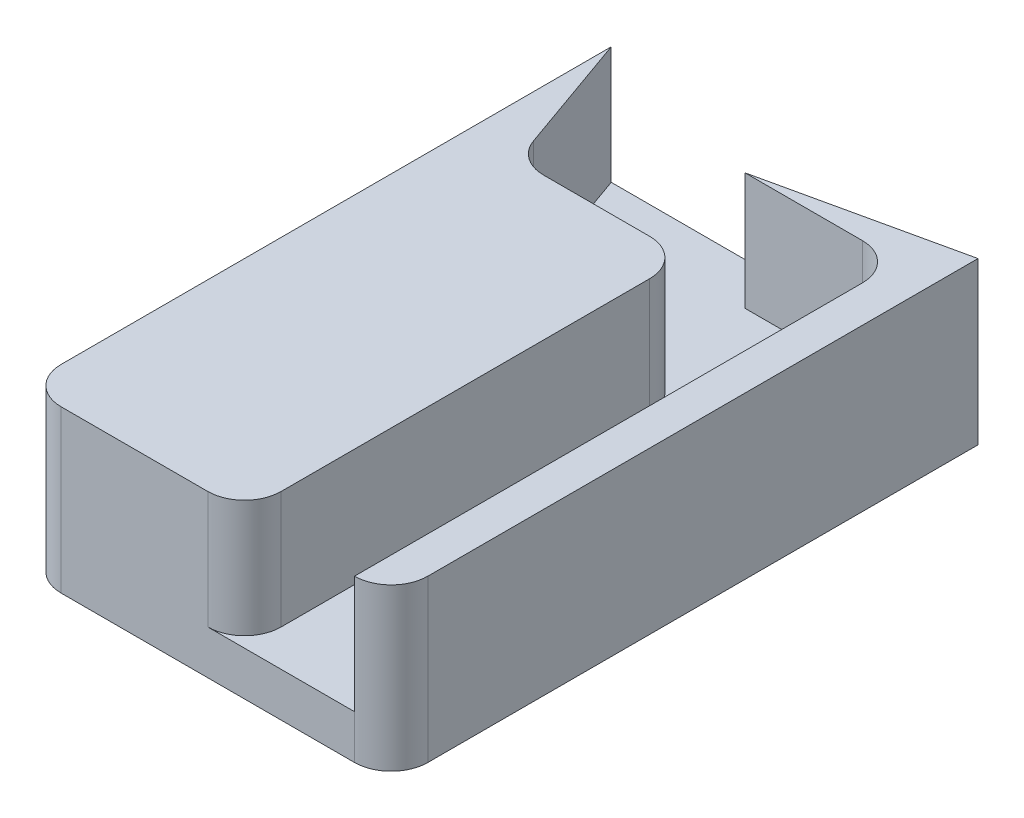
ISO-10303-21;
HEADER;
FILE_DESCRIPTION(('STEP AP214'),'2;1');
FILE_NAME('part.step','',(''),(''),'','','');
FILE_SCHEMA(('AUTOMOTIVE_DESIGN { 1 0 10303 214 1 1 1 1 }'));
ENDSEC;
DATA;
#1=APPLICATION_CONTEXT('core data for automotive mechanical design processes');
#2=APPLICATION_PROTOCOL_DEFINITION('international standard','automotive_design',2000,#1);
#3=PRODUCT_CONTEXT('',#1,'mechanical');
#4=PRODUCT('Part','Part','',(#3));
#5=PRODUCT_RELATED_PRODUCT_CATEGORY('part','',(#4));
#6=PRODUCT_DEFINITION_FORMATION('','',#4);
#7=PRODUCT_DEFINITION_CONTEXT('part definition',#1,'design');
#8=PRODUCT_DEFINITION('design','',#6,#7);
#9=PRODUCT_DEFINITION_SHAPE('','',#8);
#10=(LENGTH_UNIT() NAMED_UNIT(*) SI_UNIT(.MILLI.,.METRE.));
#11=(NAMED_UNIT(*) PLANE_ANGLE_UNIT() SI_UNIT($,.RADIAN.));
#12=(NAMED_UNIT(*) SI_UNIT($,.STERADIAN.) SOLID_ANGLE_UNIT());
#13=UNCERTAINTY_MEASURE_WITH_UNIT(LENGTH_MEASURE(1.E-05),#10,'distance_accuracy_value','');
#14=(GEOMETRIC_REPRESENTATION_CONTEXT(3) GLOBAL_UNCERTAINTY_ASSIGNED_CONTEXT((#13)) GLOBAL_UNIT_ASSIGNED_CONTEXT((#10,
#11,#12)) REPRESENTATION_CONTEXT('',''));
#15=CARTESIAN_POINT('',(0.,0.,0.));
#16=DIRECTION('',(0.,0.,1.));
#17=DIRECTION('',(1.,0.,0.));
#18=AXIS2_PLACEMENT_3D('',#15,#16,#17);
#19=CARTESIAN_POINT('',(-77.9455073119252,20.,68.2833333333333));
#20=DIRECTION('',(0.,0.,-1.));
#21=DIRECTION('',(-1.,0.,0.));
#22=AXIS2_PLACEMENT_3D('',#19,#20,#21);
#23=PLANE('',#22);
#24=CARTESIAN_POINT('',(-67.2289175817584,16.8679193858878,68.2833333333333));
#25=DIRECTION('',(0.,0.,-1.));
#26=DIRECTION('',(-1.,0.,0.));
#27=AXIS2_PLACEMENT_3D('',#24,#25,#26);
#28=CIRCLE('',#27,2.6);
#29=CARTESIAN_POINT('',(-69.8289175817584,16.8679193858878,68.2833333333333));
#30=VERTEX_POINT('',#29);
#31=EDGE_CURVE('E295',#30,#30,#28,.F.);
#32=ORIENTED_EDGE('',*,*,#31,.F.);
#33=EDGE_LOOP('',(#32));
#34=FACE_BOUND('',#33,.T.);
#35=CARTESIAN_POINT('',(-59.1289175817584,16.8679193858878,68.2833333333333));
#36=DIRECTION('',(0.,0.,-1.));
#37=DIRECTION('',(-1.,0.,0.));
#38=AXIS2_PLACEMENT_3D('',#35,#36,#37);
#39=CIRCLE('',#38,2.6);
#40=CARTESIAN_POINT('',(-61.7289175817584,16.8679193858878,68.2833333333333));
#41=VERTEX_POINT('',#40);
#42=EDGE_CURVE('E286',#41,#41,#39,.F.);
#43=ORIENTED_EDGE('',*,*,#42,.F.);
#44=EDGE_LOOP('',(#43));
#45=FACE_BOUND('',#44,.T.);
#46=DIRECTION('',(0.,-1.,0.));
#47=VECTOR('',#46,1.);
#48=CARTESIAN_POINT('',(-77.9107781164221,10.,68.2833333333333));
#49=LINE('',#48,#47);
#50=CARTESIAN_POINT('',(-77.9107781164221,10.,68.2833333333333));
#51=VERTEX_POINT('',#50);
#52=CARTESIAN_POINT('',(-77.9107781164221,0.,68.2833333333333));
#53=VERTEX_POINT('',#52);
#54=EDGE_CURVE('E255',#51,#53,#49,.T.);
#55=ORIENTED_EDGE('',*,*,#54,.F.);
#56=DIRECTION('',(-1.,0.,0.));
#57=VECTOR('',#56,1.);
#58=CARTESIAN_POINT('',(-77.9107781164221,10.,68.2833333333333));
#59=LINE('',#58,#57);
#60=CARTESIAN_POINT('',(-53.9455073119252,10.,68.2833333333333));
#61=VERTEX_POINT('',#60);
#62=EDGE_CURVE('E251',#61,#51,#59,.T.);
#63=ORIENTED_EDGE('',*,*,#62,.F.);
#64=DIRECTION('',(0.,-1.,0.));
#65=VECTOR('',#64,1.);
#66=CARTESIAN_POINT('',(-53.9455073119252,20.,68.2833333333333));
#67=LINE('',#66,#65);
#68=CARTESIAN_POINT('',(-53.9455073119252,20.,68.2833333333333));
#69=VERTEX_POINT('',#68);
#70=EDGE_CURVE('E290',#69,#61,#67,.T.);
#71=ORIENTED_EDGE('',*,*,#70,.F.);
#72=DIRECTION('',(1.,0.,0.));
#73=VECTOR('',#72,1.);
#74=CARTESIAN_POINT('',(-77.9455073119252,20.,68.2833333333333));
#75=LINE('',#74,#73);
#76=CARTESIAN_POINT('',(-77.9455073119252,20.,68.2833333333333));
#77=VERTEX_POINT('',#76);
#78=EDGE_CURVE('E269',#77,#69,#75,.T.);
#79=ORIENTED_EDGE('',*,*,#78,.F.);
#80=DIRECTION('',(0.,-1.,0.));
#81=VECTOR('',#80,1.);
#82=CARTESIAN_POINT('',(-77.9455073119252,20.,68.2833333333333));
#83=LINE('',#82,#81);
#84=CARTESIAN_POINT('',(-77.9455073119252,0.,68.2833333333333));
#85=VERTEX_POINT('',#84);
#86=EDGE_CURVE('E278',#77,#85,#83,.T.);
#87=ORIENTED_EDGE('',*,*,#86,.T.);
#88=DIRECTION('',(1.,0.,0.));
#89=VECTOR('',#88,1.);
#90=CARTESIAN_POINT('',(-77.9455073119252,0.,68.2833333333333));
#91=LINE('',#90,#89);
#92=EDGE_CURVE('E260',#85,#53,#91,.T.);
#93=ORIENTED_EDGE('',*,*,#92,.T.);
#94=EDGE_LOOP('',(#55,#63,#71,#79,#87,#93));
#95=FACE_BOUND('',#94,.T.);
#96=ADVANCED_FACE('F71',(#34,#45,#95),#23,.F.);
#97=CARTESIAN_POINT('',(-53.9455073119252,20.,116.033333333333));
#98=DIRECTION('',(1.,0.,0.));
#99=DIRECTION('',(0.,0.,-1.));
#100=AXIS2_PLACEMENT_3D('',#97,#98,#99);
#101=PLANE('',#100);
#102=DIRECTION('',(0.,0.,-1.));
#103=VECTOR('',#102,1.);
#104=CARTESIAN_POINT('',(-53.9455073119252,10.,84.2833333333333));
#105=LINE('',#104,#103);
#106=CARTESIAN_POINT('',(-53.9455073119252,10.,84.2833333333333));
#107=VERTEX_POINT('',#106);
#108=EDGE_CURVE('E258',#107,#61,#105,.T.);
#109=ORIENTED_EDGE('',*,*,#108,.F.);
#110=DIRECTION('',(0.,1.,0.));
#111=VECTOR('',#110,1.);
#112=CARTESIAN_POINT('',(-53.9455073119252,10.,84.2833333333333));
#113=LINE('',#112,#111);
#114=CARTESIAN_POINT('',(-53.9455073119252,0.,84.2833333333333));
#115=VERTEX_POINT('',#114);
#116=EDGE_CURVE('E241',#115,#107,#113,.T.);
#117=ORIENTED_EDGE('',*,*,#116,.F.);
#118=DIRECTION('',(0.,0.,1.));
#119=VECTOR('',#118,1.);
#120=CARTESIAN_POINT('',(-53.9455073119252,0.,116.033333333333));
#121=LINE('',#120,#119);
#122=CARTESIAN_POINT('',(-53.9455073119252,0.,116.033333333333));
#123=VERTEX_POINT('',#122);
#124=EDGE_CURVE('E238',#115,#123,#121,.T.);
#125=ORIENTED_EDGE('',*,*,#124,.T.);
#126=DIRECTION('',(0.,-1.,0.));
#127=VECTOR('',#126,1.);
#128=CARTESIAN_POINT('',(-53.9455073119252,20.,116.033333333333));
#129=LINE('',#128,#127);
#130=CARTESIAN_POINT('',(-53.9455073119252,20.,116.033333333333));
#131=VERTEX_POINT('',#130);
#132=EDGE_CURVE('E287',#131,#123,#129,.T.);
#133=ORIENTED_EDGE('',*,*,#132,.F.);
#134=DIRECTION('',(0.,0.,1.));
#135=VECTOR('',#134,1.);
#136=CARTESIAN_POINT('',(-53.9455073119252,20.,116.033333333333));
#137=LINE('',#136,#135);
#138=EDGE_CURVE('E273',#69,#131,#137,.T.);
#139=ORIENTED_EDGE('',*,*,#138,.F.);
#140=ORIENTED_EDGE('',*,*,#70,.T.);
#141=EDGE_LOOP('',(#109,#117,#125,#133,#139,#140));
#142=FACE_BOUND('',#141,.T.);
#143=ADVANCED_FACE('F493',(#142),#101,.F.);
#144=CARTESIAN_POINT('',(0.,6.,0.));
#145=DIRECTION('',(0.,1.,0.));
#146=DIRECTION('',(0.,0.,1.));
#147=AXIS2_PLACEMENT_3D('',#144,#145,#146);
#148=PLANE('',#147);
#149=DIRECTION('',(0.,0.,-1.));
#150=VECTOR('',#149,1.);
#151=CARTESIAN_POINT('',(-35.9455073119252,6.,0.));
#152=LINE('',#151,#150);
#153=CARTESIAN_POINT('',(-35.9455073119252,6.,118.533333333333));
#154=VERTEX_POINT('',#153);
#155=CARTESIAN_POINT('',(-35.9455073119252,6.,49.2928298834887));
#156=VERTEX_POINT('',#155);
#157=EDGE_CURVE('E309',#154,#156,#152,.T.);
#158=ORIENTED_EDGE('',*,*,#157,.T.);
#159=CARTESIAN_POINT('',(-40.9455073119252,6.,49.2928298834887));
#160=DIRECTION('',(0.,1.,0.));
#161=DIRECTION('',(0.,0.,1.));
#162=AXIS2_PLACEMENT_3D('',#159,#160,#161);
#163=CIRCLE('',#162,5.);
#164=CARTESIAN_POINT('',(-40.9455073119252,6.,44.2928298834887));
#165=VERTEX_POINT('',#164);
#166=EDGE_CURVE('E400',#156,#165,#163,.T.);
#167=ORIENTED_EDGE('',*,*,#166,.T.);
#168=DIRECTION('',(1.,0.,0.));
#169=VECTOR('',#168,1.);
#170=CARTESIAN_POINT('',(0.,6.,44.2928298834887));
#171=LINE('',#170,#169);
#172=CARTESIAN_POINT('',(-56.9455073119252,6.,44.2928298834887));
#173=VERTEX_POINT('',#172);
#174=EDGE_CURVE('E320',#173,#165,#171,.T.);
#175=ORIENTED_EDGE('',*,*,#174,.F.);
#176=DIRECTION('',(-0.976332213807184,0.,0.216276231431849));
#177=VECTOR('',#176,1.);
#178=CARTESIAN_POINT('',(6.68911173807514,6.,30.1965464646837));
#179=LINE('',#178,#177);
#180=CARTESIAN_POINT('',(-30.9455073119252,6.,38.5333333333333));
#181=VERTEX_POINT('',#180);
#182=EDGE_CURVE('E302',#181,#173,#179,.T.);
#183=ORIENTED_EDGE('',*,*,#182,.F.);
#184=DIRECTION('',(-1.,0.,0.));
#185=VECTOR('',#184,1.);
#186=CARTESIAN_POINT('',(-80.9455073119252,6.,38.5333333333333));
#187=LINE('',#186,#185);
#188=CARTESIAN_POINT('',(-80.9455073119252,6.,38.5333333333333));
#189=VERTEX_POINT('',#188);
#190=EDGE_CURVE('E359',#181,#189,#187,.T.);
#191=ORIENTED_EDGE('',*,*,#190,.T.);
#192=DIRECTION('',(-0.333925343667691,0.,-0.942599525173026));
#193=VECTOR('',#192,1.);
#194=CARTESIAN_POINT('',(-84.048256573148,6.,29.7749385728864));
#195=LINE('',#194,#193);
#196=CARTESIAN_POINT('',(-75.1253254774567,6.,54.9624566018272));
#197=VERTEX_POINT('',#196);
#198=EDGE_CURVE('E350',#197,#189,#195,.T.);
#199=ORIENTED_EDGE('',*,*,#198,.F.);
#200=CARTESIAN_POINT('',(-70.4123278515916,6.,53.2928298834888));
#201=DIRECTION('',(0.,1.,0.));
#202=DIRECTION('',(0.,0.,1.));
#203=AXIS2_PLACEMENT_3D('',#200,#201,#202);
#204=CIRCLE('',#203,5.);
#205=CARTESIAN_POINT('',(-70.4123278515916,6.,58.2928298834887));
#206=VERTEX_POINT('',#205);
#207=EDGE_CURVE('E390',#197,#206,#204,.T.);
#208=ORIENTED_EDGE('',*,*,#207,.T.);
#209=DIRECTION('',(-1.,0.,0.));
#210=VECTOR('',#209,1.);
#211=CARTESIAN_POINT('',(0.,6.,58.2928298834887));
#212=LINE('',#211,#210);
#213=CARTESIAN_POINT('',(-55.9455073119252,6.,58.2928298834887));
#214=VERTEX_POINT('',#213);
#215=EDGE_CURVE('E333',#214,#206,#212,.T.);
#216=ORIENTED_EDGE('',*,*,#215,.F.);
#217=CARTESIAN_POINT('',(-55.9455073119252,6.,63.2928298834887));
#218=DIRECTION('',(0.,1.,0.));
#219=DIRECTION('',(0.,0.,1.));
#220=AXIS2_PLACEMENT_3D('',#217,#218,#219);
#221=CIRCLE('',#220,5.);
#222=CARTESIAN_POINT('',(-50.9455073119252,6.,63.2928298834887));
#223=VERTEX_POINT('',#222);
#224=EDGE_CURVE('E392',#214,#223,#221,.F.);
#225=ORIENTED_EDGE('',*,*,#224,.T.);
#226=DIRECTION('',(0.,0.,-1.));
#227=VECTOR('',#226,1.);
#228=CARTESIAN_POINT('',(-50.9455073119252,6.,0.));
#229=LINE('',#228,#227);
#230=CARTESIAN_POINT('',(-50.9455073119252,6.,113.533333333333));
#231=VERTEX_POINT('',#230);
#232=EDGE_CURVE('E338',#231,#223,#229,.T.);
#233=ORIENTED_EDGE('',*,*,#232,.F.);
#234=CARTESIAN_POINT('',(-55.9455073119252,6.,113.533333333333));
#235=DIRECTION('',(0.,1.,0.));
#236=DIRECTION('',(0.,0.,1.));
#237=AXIS2_PLACEMENT_3D('',#234,#235,#236);
#238=CIRCLE('',#237,5.);
#239=CARTESIAN_POINT('',(-55.9455073119252,6.,118.533333333333));
#240=VERTEX_POINT('',#239);
#241=EDGE_CURVE('E12',#231,#240,#238,.F.);
#242=ORIENTED_EDGE('',*,*,#241,.T.);
#243=DIRECTION('',(1.,0.,0.));
#244=VECTOR('',#243,1.);
#245=CARTESIAN_POINT('',(-80.9455073119252,6.,118.533333333333));
#246=LINE('',#245,#244);
#247=EDGE_CURVE('E356',#240,#154,#246,.T.);
#248=ORIENTED_EDGE('',*,*,#247,.T.);
#249=EDGE_LOOP('',(#158,#167,#175,#183,#191,#199,#208,#216,#225,#233,#242,#248));
#250=FACE_BOUND('',#249,.T.);
#251=ADVANCED_FACE('F432',(#250),#148,.T.);
#252=CARTESIAN_POINT('',(-80.9455073119252,6.,38.5333333333333));
#253=DIRECTION('',(1.,0.,0.));
#254=DIRECTION('',(0.,0.,-1.));
#255=AXIS2_PLACEMENT_3D('',#252,#253,#254);
#256=PLANE('',#255);
#257=DIRECTION('',(0.,0.,1.));
#258=VECTOR('',#257,1.);
#259=CARTESIAN_POINT('',(-80.9455073119252,0.,38.5333333333333));
#260=LINE('',#259,#258);
#261=CARTESIAN_POINT('',(-80.9455073119252,0.,38.5333333333333));
#262=VERTEX_POINT('',#261);
#263=CARTESIAN_POINT('',(-80.9455073119252,0.,113.533333333333));
#264=VERTEX_POINT('',#263);
#265=EDGE_CURVE('E355',#262,#264,#260,.T.);
#266=ORIENTED_EDGE('',*,*,#265,.T.);
#267=DIRECTION('',(0.,-1.,0.));
#268=VECTOR('',#267,1.);
#269=CARTESIAN_POINT('',(-80.9455073119252,6.,113.533333333333));
#270=LINE('',#269,#268);
#271=CARTESIAN_POINT('',(-80.9455073119252,22.,113.533333333333));
#272=VERTEX_POINT('',#271);
#273=EDGE_CURVE('E424',#264,#272,#270,.F.);
#274=ORIENTED_EDGE('',*,*,#273,.T.);
#275=DIRECTION('',(0.,0.,1.));
#276=VECTOR('',#275,1.);
#277=CARTESIAN_POINT('',(-80.9455073119252,22.,0.));
#278=LINE('',#277,#276);
#279=CARTESIAN_POINT('',(-80.9455073119252,22.,38.5333333333333));
#280=VERTEX_POINT('',#279);
#281=EDGE_CURVE('E340',#280,#272,#278,.T.);
#282=ORIENTED_EDGE('',*,*,#281,.F.);
#283=DIRECTION('',(0.,-1.,0.));
#284=VECTOR('',#283,1.);
#285=CARTESIAN_POINT('',(-80.9455073119252,22.,38.5333333333333));
#286=LINE('',#285,#284);
#287=EDGE_CURVE('E347',#280,#189,#286,.T.);
#288=ORIENTED_EDGE('',*,*,#287,.T.);
#289=DIRECTION('',(0.,-1.,0.));
#290=VECTOR('',#289,1.);
#291=CARTESIAN_POINT('',(-80.9455073119252,6.,38.5333333333333));
#292=LINE('',#291,#290);
#293=EDGE_CURVE('E363',#189,#262,#292,.T.);
#294=ORIENTED_EDGE('',*,*,#293,.T.);
#295=EDGE_LOOP('',(#266,#274,#282,#288,#294));
#296=FACE_BOUND('',#295,.T.);
#297=ADVANCED_FACE('F456',(#296),#256,.F.);
#298=CARTESIAN_POINT('',(-80.9455073119252,6.,118.533333333333));
#299=DIRECTION('',(0.,0.,-1.));
#300=DIRECTION('',(-1.,0.,0.));
#301=AXIS2_PLACEMENT_3D('',#298,#299,#300);
#302=PLANE('',#301);
#303=DIRECTION('',(1.,0.,0.));
#304=VECTOR('',#303,1.);
#305=CARTESIAN_POINT('',(-80.9455073119252,0.,118.533333333333));
#306=LINE('',#305,#304);
#307=CARTESIAN_POINT('',(-75.9455073119252,0.,118.533333333333));
#308=VERTEX_POINT('',#307);
#309=CARTESIAN_POINT('',(-35.9455073119252,0.,118.533333333333));
#310=VERTEX_POINT('',#309);
#311=EDGE_CURVE('E366',#308,#310,#306,.T.);
#312=ORIENTED_EDGE('',*,*,#311,.T.);
#313=DIRECTION('',(0.,-1.,0.));
#314=VECTOR('',#313,1.);
#315=CARTESIAN_POINT('',(-35.9455073119252,6.,118.533333333333));
#316=LINE('',#315,#314);
#317=EDGE_CURVE('E420',#310,#154,#316,.F.);
#318=ORIENTED_EDGE('',*,*,#317,.T.);
#319=ORIENTED_EDGE('',*,*,#247,.F.);
#320=DIRECTION('',(0.,-1.,0.));
#321=VECTOR('',#320,1.);
#322=CARTESIAN_POINT('',(-55.9455073119252,6.,118.533333333333));
#323=LINE('',#322,#321);
#324=CARTESIAN_POINT('',(-55.9455073119252,22.,118.533333333333));
#325=VERTEX_POINT('',#324);
#326=EDGE_CURVE('E415',#240,#325,#323,.F.);
#327=ORIENTED_EDGE('',*,*,#326,.T.);
#328=DIRECTION('',(1.,0.,0.));
#329=VECTOR('',#328,1.);
#330=CARTESIAN_POINT('',(0.,22.,118.533333333333));
#331=LINE('',#330,#329);
#332=CARTESIAN_POINT('',(-75.9455073119252,22.,118.533333333333));
#333=VERTEX_POINT('',#332);
#334=EDGE_CURVE('E343',#333,#325,#331,.T.);
#335=ORIENTED_EDGE('',*,*,#334,.F.);
#336=DIRECTION('',(0.,-1.,0.));
#337=VECTOR('',#336,1.);
#338=CARTESIAN_POINT('',(-75.9455073119252,6.,118.533333333333));
#339=LINE('',#338,#337);
#340=EDGE_CURVE('E417',#333,#308,#339,.T.);
#341=ORIENTED_EDGE('',*,*,#340,.T.);
#342=EDGE_LOOP('',(#312,#318,#319,#327,#335,#341));
#343=FACE_BOUND('',#342,.T.);
#344=ADVANCED_FACE('F465',(#343),#302,.F.);
#345=CARTESIAN_POINT('',(-30.9455073119252,6.,38.5333333333333));
#346=DIRECTION('',(-1.,0.,0.));
#347=DIRECTION('',(0.,0.,1.));
#348=AXIS2_PLACEMENT_3D('',#345,#346,#347);
#349=PLANE('',#348);
#350=DIRECTION('',(0.,0.,-1.));
#351=VECTOR('',#350,1.);
#352=CARTESIAN_POINT('',(-30.9455073119252,22.,0.));
#353=LINE('',#352,#351);
#354=CARTESIAN_POINT('',(-30.9455073119252,22.,113.533333333333));
#355=VERTEX_POINT('',#354);
#356=CARTESIAN_POINT('',(-30.9455073119252,22.,38.5333333333333));
#357=VERTEX_POINT('',#356);
#358=EDGE_CURVE('E315',#355,#357,#353,.T.);
#359=ORIENTED_EDGE('',*,*,#358,.F.);
#360=DIRECTION('',(0.,-1.,0.));
#361=VECTOR('',#360,1.);
#362=CARTESIAN_POINT('',(-30.9455073119252,6.,113.533333333333));
#363=LINE('',#362,#361);
#364=CARTESIAN_POINT('',(-30.9455073119252,0.,113.533333333333));
#365=VERTEX_POINT('',#364);
#366=EDGE_CURVE('E406',#355,#365,#363,.T.);
#367=ORIENTED_EDGE('',*,*,#366,.T.);
#368=DIRECTION('',(0.,0.,-1.));
#369=VECTOR('',#368,1.);
#370=CARTESIAN_POINT('',(-30.9455073119252,0.,38.5333333333333));
#371=LINE('',#370,#369);
#372=CARTESIAN_POINT('',(-30.9455073119252,0.,38.5333333333333));
#373=VERTEX_POINT('',#372);
#374=EDGE_CURVE('E369',#365,#373,#371,.T.);
#375=ORIENTED_EDGE('',*,*,#374,.T.);
#376=DIRECTION('',(0.,-1.,0.));
#377=VECTOR('',#376,1.);
#378=CARTESIAN_POINT('',(-30.9455073119252,6.,38.5333333333333));
#379=LINE('',#378,#377);
#380=EDGE_CURVE('E374',#181,#373,#379,.T.);
#381=ORIENTED_EDGE('',*,*,#380,.F.);
#382=DIRECTION('',(0.,-1.,0.));
#383=VECTOR('',#382,1.);
#384=CARTESIAN_POINT('',(-30.9455073119252,22.,38.5333333333333));
#385=LINE('',#384,#383);
#386=EDGE_CURVE('E317',#357,#181,#385,.T.);
#387=ORIENTED_EDGE('',*,*,#386,.F.);
#388=EDGE_LOOP('',(#359,#367,#375,#381,#387));
#389=FACE_BOUND('',#388,.T.);
#390=ADVANCED_FACE('F476',(#389),#349,.F.);
#391=CARTESIAN_POINT('',(-80.9455073119252,6.,38.5333333333333));
#392=DIRECTION('',(0.,0.,1.));
#393=DIRECTION('',(1.,0.,0.));
#394=AXIS2_PLACEMENT_3D('',#391,#392,#393);
#395=PLANE('',#394);
#396=DIRECTION('',(-1.,0.,0.));
#397=VECTOR('',#396,1.);
#398=CARTESIAN_POINT('',(-80.9455073119252,0.,38.5333333333333));
#399=LINE('',#398,#397);
#400=EDGE_CURVE('E360',#373,#262,#399,.T.);
#401=ORIENTED_EDGE('',*,*,#400,.T.);
#402=ORIENTED_EDGE('',*,*,#293,.F.);
#403=ORIENTED_EDGE('',*,*,#190,.F.);
#404=ORIENTED_EDGE('',*,*,#380,.T.);
#405=EDGE_LOOP('',(#401,#402,#403,#404));
#406=FACE_BOUND('',#405,.T.);
#407=ADVANCED_FACE('F544',(#406),#395,.F.);
#408=CARTESIAN_POINT('',(0.,0.,0.));
#409=DIRECTION('',(0.,1.,0.));
#410=DIRECTION('',(0.,0.,1.));
#411=AXIS2_PLACEMENT_3D('',#408,#409,#410);
#412=PLANE('',#411);
#413=ORIENTED_EDGE('',*,*,#92,.F.);
#414=DIRECTION('',(0.,0.,-1.));
#415=VECTOR('',#414,1.);
#416=CARTESIAN_POINT('',(-77.9455073119252,0.,116.033333333333));
#417=LINE('',#416,#415);
#418=CARTESIAN_POINT('',(-77.9455073119252,0.,116.033333333333));
#419=VERTEX_POINT('',#418);
#420=EDGE_CURVE('E257',#419,#85,#417,.T.);
#421=ORIENTED_EDGE('',*,*,#420,.F.);
#422=DIRECTION('',(-1.,0.,0.));
#423=VECTOR('',#422,1.);
#424=CARTESIAN_POINT('',(-77.9455073119252,0.,116.033333333333));
#425=LINE('',#424,#423);
#426=EDGE_CURVE('E270',#123,#419,#425,.T.);
#427=ORIENTED_EDGE('',*,*,#426,.F.);
#428=ORIENTED_EDGE('',*,*,#124,.F.);
#429=DIRECTION('',(1.,0.,0.));
#430=VECTOR('',#429,1.);
#431=CARTESIAN_POINT('',(-77.9107781164221,0.,84.2833333333333));
#432=LINE('',#431,#430);
#433=CARTESIAN_POINT('',(-77.9107781164221,0.,84.2833333333333));
#434=VERTEX_POINT('',#433);
#435=EDGE_CURVE('E229',#434,#115,#432,.T.);
#436=ORIENTED_EDGE('',*,*,#435,.F.);
#437=DIRECTION('',(0.,0.,-1.));
#438=VECTOR('',#437,1.);
#439=CARTESIAN_POINT('',(-77.9107781164221,0.,84.2833333333333));
#440=LINE('',#439,#438);
#441=EDGE_CURVE('E235',#434,#53,#440,.T.);
#442=ORIENTED_EDGE('',*,*,#441,.T.);
#443=EDGE_LOOP('',(#413,#421,#427,#428,#436,#442));
#444=FACE_BOUND('',#443,.T.);
#445=ORIENTED_EDGE('',*,*,#374,.F.);
#446=CARTESIAN_POINT('',(-35.9455073119252,0.,113.533333333333));
#447=DIRECTION('',(0.,1.,0.));
#448=DIRECTION('',(0.,0.,1.));
#449=AXIS2_PLACEMENT_3D('',#446,#447,#448);
#450=CIRCLE('',#449,5.);
#451=EDGE_CURVE('E413',#365,#310,#450,.F.);
#452=ORIENTED_EDGE('',*,*,#451,.T.);
#453=ORIENTED_EDGE('',*,*,#311,.F.);
#454=CARTESIAN_POINT('',(-75.9455073119252,0.,113.533333333333));
#455=DIRECTION('',(0.,1.,0.));
#456=DIRECTION('',(0.,0.,1.));
#457=AXIS2_PLACEMENT_3D('',#454,#455,#456);
#458=CIRCLE('',#457,5.);
#459=EDGE_CURVE('E411',#308,#264,#458,.F.);
#460=ORIENTED_EDGE('',*,*,#459,.T.);
#461=ORIENTED_EDGE('',*,*,#265,.F.);
#462=ORIENTED_EDGE('',*,*,#400,.F.);
#463=EDGE_LOOP('',(#445,#452,#453,#460,#461,#462));
#464=FACE_BOUND('',#463,.T.);
#465=ADVANCED_FACE('F232',(#444,#464),#412,.F.);
#466=CARTESIAN_POINT('',(0.,22.,58.2928298834887));
#467=DIRECTION('',(0.,0.,1.));
#468=DIRECTION('',(1.,0.,0.));
#469=AXIS2_PLACEMENT_3D('',#466,#467,#468);
#470=PLANE('',#469);
#471=CARTESIAN_POINT('',(-59.1289175817584,16.8679193858878,58.2928298834887));
#472=DIRECTION('',(0.,0.,-1.));
#473=DIRECTION('',(-1.,0.,0.));
#474=AXIS2_PLACEMENT_3D('',#471,#472,#473);
#475=CIRCLE('',#474,2.6);
#476=CARTESIAN_POINT('',(-61.7289175817584,16.8679193858878,58.2928298834887));
#477=VERTEX_POINT('',#476);
#478=EDGE_CURVE('E299',#477,#477,#475,.T.);
#479=ORIENTED_EDGE('',*,*,#478,.F.);
#480=EDGE_LOOP('',(#479));
#481=FACE_BOUND('',#480,.T.);
#482=CARTESIAN_POINT('',(-67.2289175817584,16.8679193858878,58.2928298834887));
#483=DIRECTION('',(0.,0.,-1.));
#484=DIRECTION('',(-1.,0.,0.));
#485=AXIS2_PLACEMENT_3D('',#482,#483,#484);
#486=CIRCLE('',#485,2.6);
#487=CARTESIAN_POINT('',(-69.8289175817584,16.8679193858878,58.2928298834887));
#488=VERTEX_POINT('',#487);
#489=EDGE_CURVE('E298',#488,#488,#486,.T.);
#490=ORIENTED_EDGE('',*,*,#489,.F.);
#491=EDGE_LOOP('',(#490));
#492=FACE_BOUND('',#491,.T.);
#493=DIRECTION('',(-1.,0.,0.));
#494=VECTOR('',#493,1.);
#495=CARTESIAN_POINT('',(0.,22.,58.2928298834887));
#496=LINE('',#495,#494);
#497=CARTESIAN_POINT('',(-55.9455073119252,22.,58.2928298834887));
#498=VERTEX_POINT('',#497);
#499=CARTESIAN_POINT('',(-70.4123278515916,22.,58.2928298834887));
#500=VERTEX_POINT('',#499);
#501=EDGE_CURVE('E334',#498,#500,#496,.T.);
#502=ORIENTED_EDGE('',*,*,#501,.F.);
#503=DIRECTION('',(0.,-1.,0.));
#504=VECTOR('',#503,1.);
#505=CARTESIAN_POINT('',(-55.9455073119252,22.,58.2928298834887));
#506=LINE('',#505,#504);
#507=EDGE_CURVE('E379',#498,#214,#506,.T.);
#508=ORIENTED_EDGE('',*,*,#507,.T.);
#509=ORIENTED_EDGE('',*,*,#215,.T.);
#510=DIRECTION('',(0.,-1.,0.));
#511=VECTOR('',#510,1.);
#512=CARTESIAN_POINT('',(-70.4123278515916,22.,58.2928298834887));
#513=LINE('',#512,#511);
#514=EDGE_CURVE('E377',#206,#500,#513,.F.);
#515=ORIENTED_EDGE('',*,*,#514,.T.);
#516=EDGE_LOOP('',(#502,#508,#509,#515));
#517=FACE_BOUND('',#516,.T.);
#518=ADVANCED_FACE('F443',(#481,#492,#517),#470,.F.);
#519=CARTESIAN_POINT('',(-84.048256573148,22.,29.7749385728864));
#520=DIRECTION('',(-0.942599525173026,0.,0.333925343667691));
#521=DIRECTION('',(0.333925343667691,0.,0.942599525173026));
#522=AXIS2_PLACEMENT_3D('',#519,#520,#521);
#523=PLANE('',#522);
#524=DIRECTION('',(-0.333925343667691,0.,-0.942599525173026));
#525=VECTOR('',#524,1.);
#526=CARTESIAN_POINT('',(-84.048256573148,22.,29.7749385728864));
#527=LINE('',#526,#525);
#528=CARTESIAN_POINT('',(-75.1253254774567,22.,54.9624566018272));
#529=VERTEX_POINT('',#528);
#530=EDGE_CURVE('E337',#529,#280,#527,.T.);
#531=ORIENTED_EDGE('',*,*,#530,.F.);
#532=DIRECTION('',(0.,-1.,0.));
#533=VECTOR('',#532,1.);
#534=CARTESIAN_POINT('',(-75.1253254774567,6.00000000000001,54.9624566018272));
#535=LINE('',#534,#533);
#536=EDGE_CURVE('E387',#529,#197,#535,.T.);
#537=ORIENTED_EDGE('',*,*,#536,.T.);
#538=ORIENTED_EDGE('',*,*,#198,.T.);
#539=ORIENTED_EDGE('',*,*,#287,.F.);
#540=EDGE_LOOP('',(#531,#537,#538,#539));
#541=FACE_BOUND('',#540,.T.);
#542=ADVANCED_FACE('F451',(#541),#523,.F.);
#543=CARTESIAN_POINT('',(-50.9455073119252,22.,0.));
#544=DIRECTION('',(-1.,0.,0.));
#545=DIRECTION('',(0.,0.,1.));
#546=AXIS2_PLACEMENT_3D('',#543,#544,#545);
#547=PLANE('',#546);
#548=DIRECTION('',(0.,0.,-1.));
#549=VECTOR('',#548,1.);
#550=CARTESIAN_POINT('',(-50.9455073119252,22.,0.));
#551=LINE('',#550,#549);
#552=CARTESIAN_POINT('',(-50.9455073119252,22.,113.533333333333));
#553=VERTEX_POINT('',#552);
#554=CARTESIAN_POINT('',(-50.9455073119252,22.,63.2928298834887));
#555=VERTEX_POINT('',#554);
#556=EDGE_CURVE('E345',#553,#555,#551,.T.);
#557=ORIENTED_EDGE('',*,*,#556,.F.);
#558=DIRECTION('',(0.,-1.,0.));
#559=VECTOR('',#558,1.);
#560=CARTESIAN_POINT('',(-50.9455073119252,22.,113.533333333333));
#561=LINE('',#560,#559);
#562=EDGE_CURVE('E79',#553,#231,#561,.T.);
#563=ORIENTED_EDGE('',*,*,#562,.T.);
#564=ORIENTED_EDGE('',*,*,#232,.T.);
#565=DIRECTION('',(0.,-1.,0.));
#566=VECTOR('',#565,1.);
#567=CARTESIAN_POINT('',(-50.9455073119252,22.,63.2928298834887));
#568=LINE('',#567,#566);
#569=EDGE_CURVE('E382',#223,#555,#568,.F.);
#570=ORIENTED_EDGE('',*,*,#569,.T.);
#571=EDGE_LOOP('',(#557,#563,#564,#570));
#572=FACE_BOUND('',#571,.T.);
#573=ADVANCED_FACE('F430',(#572),#547,.F.);
#574=CARTESIAN_POINT('',(0.,22.,0.));
#575=DIRECTION('',(0.,1.,0.));
#576=DIRECTION('',(0.,0.,1.));
#577=AXIS2_PLACEMENT_3D('',#574,#575,#576);
#578=PLANE('',#577);
#579=ORIENTED_EDGE('',*,*,#281,.T.);
#580=CARTESIAN_POINT('',(-75.9455073119252,22.,113.533333333333));
#581=DIRECTION('',(0.,1.,0.));
#582=DIRECTION('',(0.,0.,1.));
#583=AXIS2_PLACEMENT_3D('',#580,#581,#582);
#584=CIRCLE('',#583,5.);
#585=EDGE_CURVE('E427',#272,#333,#584,.T.);
#586=ORIENTED_EDGE('',*,*,#585,.T.);
#587=ORIENTED_EDGE('',*,*,#334,.T.);
#588=CARTESIAN_POINT('',(-55.9455073119252,22.,113.533333333333));
#589=DIRECTION('',(0.,1.,0.));
#590=DIRECTION('',(0.,0.,1.));
#591=AXIS2_PLACEMENT_3D('',#588,#589,#590);
#592=CIRCLE('',#591,5.);
#593=EDGE_CURVE('E92',#325,#553,#592,.T.);
#594=ORIENTED_EDGE('',*,*,#593,.T.);
#595=ORIENTED_EDGE('',*,*,#556,.T.);
#596=CARTESIAN_POINT('',(-55.9455073119252,22.,63.2928298834887));
#597=DIRECTION('',(0.,1.,0.));
#598=DIRECTION('',(0.,0.,1.));
#599=AXIS2_PLACEMENT_3D('',#596,#597,#598);
#600=CIRCLE('',#599,5.);
#601=EDGE_CURVE('E385',#555,#498,#600,.T.);
#602=ORIENTED_EDGE('',*,*,#601,.T.);
#603=ORIENTED_EDGE('',*,*,#501,.T.);
#604=CARTESIAN_POINT('',(-70.4123278515916,22.,53.2928298834888));
#605=DIRECTION('',(0.,1.,0.));
#606=DIRECTION('',(0.,0.,1.));
#607=AXIS2_PLACEMENT_3D('',#604,#605,#606);
#608=CIRCLE('',#607,5.);
#609=EDGE_CURVE('E395',#500,#529,#608,.F.);
#610=ORIENTED_EDGE('',*,*,#609,.T.);
#611=ORIENTED_EDGE('',*,*,#530,.T.);
#612=EDGE_LOOP('',(#579,#586,#587,#594,#595,#602,#603,#610,#611));
#613=FACE_BOUND('',#612,.T.);
#614=ADVANCED_FACE('F440',(#613),#578,.T.);
#615=CARTESIAN_POINT('',(6.68911173807514,22.,30.1965464646837));
#616=DIRECTION('',(0.216276231431849,0.,0.976332213807184));
#617=DIRECTION('',(0.976332213807184,0.,-0.216276231431849));
#618=AXIS2_PLACEMENT_3D('',#615,#616,#617);
#619=PLANE('',#618);
#620=ORIENTED_EDGE('',*,*,#182,.T.);
#621=DIRECTION('',(0.,-1.,0.));
#622=VECTOR('',#621,1.);
#623=CARTESIAN_POINT('',(-56.9455073119252,22.,44.2928298834887));
#624=LINE('',#623,#622);
#625=CARTESIAN_POINT('',(-56.9455073119252,22.,44.2928298834887));
#626=VERTEX_POINT('',#625);
#627=EDGE_CURVE('E330',#626,#173,#624,.T.);
#628=ORIENTED_EDGE('',*,*,#627,.F.);
#629=DIRECTION('',(-0.976332213807184,0.,0.216276231431849));
#630=VECTOR('',#629,1.);
#631=CARTESIAN_POINT('',(6.68911173807514,22.,30.1965464646837));
#632=LINE('',#631,#630);
#633=EDGE_CURVE('E305',#357,#626,#632,.T.);
#634=ORIENTED_EDGE('',*,*,#633,.F.);
#635=ORIENTED_EDGE('',*,*,#386,.T.);
#636=EDGE_LOOP('',(#620,#628,#634,#635));
#637=FACE_BOUND('',#636,.T.);
#638=ADVANCED_FACE('F526',(#637),#619,.F.);
#639=CARTESIAN_POINT('',(0.,22.,44.2928298834887));
#640=DIRECTION('',(0.,0.,-1.));
#641=DIRECTION('',(-1.,0.,0.));
#642=AXIS2_PLACEMENT_3D('',#639,#640,#641);
#643=PLANE('',#642);
#644=ORIENTED_EDGE('',*,*,#174,.T.);
#645=DIRECTION('',(0.,-1.,0.));
#646=VECTOR('',#645,1.);
#647=CARTESIAN_POINT('',(-40.9455073119252,22.,44.2928298834887));
#648=LINE('',#647,#646);
#649=CARTESIAN_POINT('',(-40.9455073119252,22.,44.2928298834887));
#650=VERTEX_POINT('',#649);
#651=EDGE_CURVE('E402',#165,#650,#648,.F.);
#652=ORIENTED_EDGE('',*,*,#651,.T.);
#653=DIRECTION('',(1.,0.,0.));
#654=VECTOR('',#653,1.);
#655=CARTESIAN_POINT('',(0.,22.,44.2928298834887));
#656=LINE('',#655,#654);
#657=EDGE_CURVE('E308',#626,#650,#656,.T.);
#658=ORIENTED_EDGE('',*,*,#657,.F.);
#659=ORIENTED_EDGE('',*,*,#627,.T.);
#660=EDGE_LOOP('',(#644,#652,#658,#659));
#661=FACE_BOUND('',#660,.T.);
#662=ADVANCED_FACE('F523',(#661),#643,.F.);
#663=CARTESIAN_POINT('',(-35.9455073119252,22.,0.));
#664=DIRECTION('',(-1.,0.,0.));
#665=DIRECTION('',(0.,0.,1.));
#666=AXIS2_PLACEMENT_3D('',#663,#664,#665);
#667=PLANE('',#666);
#668=DIRECTION('',(0.,0.,-1.));
#669=VECTOR('',#668,1.);
#670=CARTESIAN_POINT('',(-35.9455073119252,22.,0.));
#671=LINE('',#670,#669);
#672=CARTESIAN_POINT('',(-35.9455073119252,22.,118.533333333333));
#673=VERTEX_POINT('',#672);
#674=CARTESIAN_POINT('',(-35.9455073119252,22.,49.2928298834887));
#675=VERTEX_POINT('',#674);
#676=EDGE_CURVE('E312',#673,#675,#671,.T.);
#677=ORIENTED_EDGE('',*,*,#676,.T.);
#678=DIRECTION('',(0.,-1.,0.));
#679=VECTOR('',#678,1.);
#680=CARTESIAN_POINT('',(-35.9455073119252,22.,49.2928298834887));
#681=LINE('',#680,#679);
#682=EDGE_CURVE('E397',#675,#156,#681,.T.);
#683=ORIENTED_EDGE('',*,*,#682,.T.);
#684=ORIENTED_EDGE('',*,*,#157,.F.);
#685=DIRECTION('',(0.,-1.,0.));
#686=VECTOR('',#685,1.);
#687=CARTESIAN_POINT('',(-35.9455073119252,22.,118.533333333333));
#688=LINE('',#687,#686);
#689=EDGE_CURVE('E327',#673,#154,#688,.T.);
#690=ORIENTED_EDGE('',*,*,#689,.F.);
#691=EDGE_LOOP('',(#677,#683,#684,#690));
#692=FACE_BOUND('',#691,.T.);
#693=ADVANCED_FACE('F486',(#692),#667,.T.);
#694=CARTESIAN_POINT('',(0.,22.,0.));
#695=DIRECTION('',(0.,1.,0.));
#696=DIRECTION('',(0.,0.,1.));
#697=AXIS2_PLACEMENT_3D('',#694,#695,#696);
#698=PLANE('',#697);
#699=ORIENTED_EDGE('',*,*,#676,.F.);
#700=CARTESIAN_POINT('',(-35.9455073119252,22.,113.533333333333));
#701=DIRECTION('',(0.,1.,0.));
#702=DIRECTION('',(0.,0.,1.));
#703=AXIS2_PLACEMENT_3D('',#700,#701,#702);
#704=CIRCLE('',#703,5.);
#705=EDGE_CURVE('E422',#673,#355,#704,.T.);
#706=ORIENTED_EDGE('',*,*,#705,.T.);
#707=ORIENTED_EDGE('',*,*,#358,.T.);
#708=ORIENTED_EDGE('',*,*,#633,.T.);
#709=ORIENTED_EDGE('',*,*,#657,.T.);
#710=CARTESIAN_POINT('',(-40.9455073119252,22.,49.2928298834887));
#711=DIRECTION('',(0.,1.,0.));
#712=DIRECTION('',(0.,0.,1.));
#713=AXIS2_PLACEMENT_3D('',#710,#711,#712);
#714=CIRCLE('',#713,5.);
#715=EDGE_CURVE('E404',#650,#675,#714,.F.);
#716=ORIENTED_EDGE('',*,*,#715,.T.);
#717=EDGE_LOOP('',(#699,#706,#707,#708,#709,#716));
#718=FACE_BOUND('',#717,.T.);
#719=ADVANCED_FACE('F482',(#718),#698,.T.);
#720=CARTESIAN_POINT('',(-55.9455073119252,22.,63.2928298834887));
#721=DIRECTION('',(0.,-1.,0.));
#722=DIRECTION('',(0.,0.,-1.));
#723=AXIS2_PLACEMENT_3D('',#720,#721,#722);
#724=CYLINDRICAL_SURFACE('',#723,5.);
#725=ORIENTED_EDGE('',*,*,#601,.F.);
#726=ORIENTED_EDGE('',*,*,#569,.F.);
#727=ORIENTED_EDGE('',*,*,#224,.F.);
#728=ORIENTED_EDGE('',*,*,#507,.F.);
#729=EDGE_LOOP('',(#725,#726,#727,#728));
#730=FACE_BOUND('',#729,.T.);
#731=ADVANCED_FACE('F438',(#730),#724,.T.);
#732=CARTESIAN_POINT('',(-70.4123278515916,22.,53.2928298834888));
#733=DIRECTION('',(0.,1.,0.));
#734=DIRECTION('',(0.,0.,1.));
#735=AXIS2_PLACEMENT_3D('',#732,#733,#734);
#736=CYLINDRICAL_SURFACE('',#735,5.);
#737=ORIENTED_EDGE('',*,*,#609,.F.);
#738=ORIENTED_EDGE('',*,*,#514,.F.);
#739=ORIENTED_EDGE('',*,*,#207,.F.);
#740=ORIENTED_EDGE('',*,*,#536,.F.);
#741=EDGE_LOOP('',(#737,#738,#739,#740));
#742=FACE_BOUND('',#741,.T.);
#743=ADVANCED_FACE('F446',(#742),#736,.F.);
#744=CARTESIAN_POINT('',(-40.9455073119252,22.,49.2928298834887));
#745=DIRECTION('',(0.,-1.,0.));
#746=DIRECTION('',(0.,0.,-1.));
#747=AXIS2_PLACEMENT_3D('',#744,#745,#746);
#748=CYLINDRICAL_SURFACE('',#747,5.);
#749=ORIENTED_EDGE('',*,*,#715,.F.);
#750=ORIENTED_EDGE('',*,*,#651,.F.);
#751=ORIENTED_EDGE('',*,*,#166,.F.);
#752=ORIENTED_EDGE('',*,*,#682,.F.);
#753=EDGE_LOOP('',(#749,#750,#751,#752));
#754=FACE_BOUND('',#753,.T.);
#755=ADVANCED_FACE('F517',(#754),#748,.F.);
#756=CARTESIAN_POINT('',(-67.2289175817584,16.8679193858878,68.2928298834887));
#757=DIRECTION('',(0.,0.,-1.));
#758=DIRECTION('',(-1.,0.,0.));
#759=AXIS2_PLACEMENT_3D('',#756,#757,#758);
#760=CYLINDRICAL_SURFACE('',#759,2.6);
#761=ORIENTED_EDGE('',*,*,#31,.T.);
#762=EDGE_LOOP('',(#761));
#763=FACE_BOUND('',#762,.T.);
#764=ORIENTED_EDGE('',*,*,#489,.T.);
#765=EDGE_LOOP('',(#764));
#766=FACE_BOUND('',#765,.T.);
#767=ADVANCED_FACE('F513',(#763,#766),#760,.F.);
#768=CARTESIAN_POINT('',(-59.1289175817584,16.8679193858878,68.2928298834887));
#769=DIRECTION('',(0.,0.,-1.));
#770=DIRECTION('',(-1.,0.,0.));
#771=AXIS2_PLACEMENT_3D('',#768,#769,#770);
#772=CYLINDRICAL_SURFACE('',#771,2.6);
#773=ORIENTED_EDGE('',*,*,#42,.T.);
#774=EDGE_LOOP('',(#773));
#775=FACE_BOUND('',#774,.T.);
#776=ORIENTED_EDGE('',*,*,#478,.T.);
#777=EDGE_LOOP('',(#776));
#778=FACE_BOUND('',#777,.T.);
#779=ADVANCED_FACE('F509',(#775,#778),#772,.F.);
#780=CARTESIAN_POINT('',(-77.9455073119252,20.,116.033333333333));
#781=DIRECTION('',(-1.,0.,0.));
#782=DIRECTION('',(0.,0.,1.));
#783=AXIS2_PLACEMENT_3D('',#780,#781,#782);
#784=PLANE('',#783);
#785=ORIENTED_EDGE('',*,*,#420,.T.);
#786=ORIENTED_EDGE('',*,*,#86,.F.);
#787=DIRECTION('',(0.,0.,-1.));
#788=VECTOR('',#787,1.);
#789=CARTESIAN_POINT('',(-77.9455073119252,20.,116.033333333333));
#790=LINE('',#789,#788);
#791=CARTESIAN_POINT('',(-77.9455073119252,20.,116.033333333333));
#792=VERTEX_POINT('',#791);
#793=EDGE_CURVE('E266',#792,#77,#790,.T.);
#794=ORIENTED_EDGE('',*,*,#793,.F.);
#795=DIRECTION('',(0.,-1.,0.));
#796=VECTOR('',#795,1.);
#797=CARTESIAN_POINT('',(-77.9455073119252,20.,116.033333333333));
#798=LINE('',#797,#796);
#799=EDGE_CURVE('E284',#792,#419,#798,.T.);
#800=ORIENTED_EDGE('',*,*,#799,.T.);
#801=EDGE_LOOP('',(#785,#786,#794,#800));
#802=FACE_BOUND('',#801,.T.);
#803=ADVANCED_FACE('F505',(#802),#784,.F.);
#804=CARTESIAN_POINT('',(-77.9455073119252,20.,116.033333333333));
#805=DIRECTION('',(0.,0.,1.));
#806=DIRECTION('',(1.,0.,0.));
#807=AXIS2_PLACEMENT_3D('',#804,#805,#806);
#808=PLANE('',#807);
#809=ORIENTED_EDGE('',*,*,#426,.T.);
#810=ORIENTED_EDGE('',*,*,#799,.F.);
#811=DIRECTION('',(-1.,0.,0.));
#812=VECTOR('',#811,1.);
#813=CARTESIAN_POINT('',(-77.9455073119252,20.,116.033333333333));
#814=LINE('',#813,#812);
#815=EDGE_CURVE('E276',#131,#792,#814,.T.);
#816=ORIENTED_EDGE('',*,*,#815,.F.);
#817=ORIENTED_EDGE('',*,*,#132,.T.);
#818=EDGE_LOOP('',(#809,#810,#816,#817));
#819=FACE_BOUND('',#818,.T.);
#820=ADVANCED_FACE('F508',(#819),#808,.F.);
#821=CARTESIAN_POINT('',(0.,20.,0.));
#822=DIRECTION('',(0.,-1.,0.));
#823=DIRECTION('',(0.,0.,-1.));
#824=AXIS2_PLACEMENT_3D('',#821,#822,#823);
#825=PLANE('',#824);
#826=ORIENTED_EDGE('',*,*,#793,.T.);
#827=ORIENTED_EDGE('',*,*,#78,.T.);
#828=ORIENTED_EDGE('',*,*,#138,.T.);
#829=ORIENTED_EDGE('',*,*,#815,.T.);
#830=EDGE_LOOP('',(#826,#827,#828,#829));
#831=FACE_BOUND('',#830,.T.);
#832=ADVANCED_FACE('F575',(#831),#825,.T.);
#833=CARTESIAN_POINT('',(-77.9107781164221,10.,84.2833333333333));
#834=DIRECTION('',(1.,0.,0.));
#835=DIRECTION('',(0.,0.,-1.));
#836=AXIS2_PLACEMENT_3D('',#833,#834,#835);
#837=PLANE('',#836);
#838=ORIENTED_EDGE('',*,*,#54,.T.);
#839=ORIENTED_EDGE('',*,*,#441,.F.);
#840=DIRECTION('',(0.,-1.,0.));
#841=VECTOR('',#840,1.);
#842=CARTESIAN_POINT('',(-77.9107781164221,10.,84.2833333333333));
#843=LINE('',#842,#841);
#844=CARTESIAN_POINT('',(-77.9107781164221,10.,84.2833333333333));
#845=VERTEX_POINT('',#844);
#846=EDGE_CURVE('E242',#845,#434,#843,.T.);
#847=ORIENTED_EDGE('',*,*,#846,.F.);
#848=DIRECTION('',(0.,0.,-1.));
#849=VECTOR('',#848,1.);
#850=CARTESIAN_POINT('',(-77.9107781164221,10.,84.2833333333333));
#851=LINE('',#850,#849);
#852=EDGE_CURVE('E262',#845,#51,#851,.T.);
#853=ORIENTED_EDGE('',*,*,#852,.T.);
#854=EDGE_LOOP('',(#838,#839,#847,#853));
#855=FACE_BOUND('',#854,.T.);
#856=ADVANCED_FACE('F253',(#855),#837,.F.);
#857=CARTESIAN_POINT('',(-77.9107781164221,10.,84.2833333333333));
#858=DIRECTION('',(0.,-1.,0.));
#859=DIRECTION('',(0.,0.,-1.));
#860=AXIS2_PLACEMENT_3D('',#857,#858,#859);
#861=PLANE('',#860);
#862=ORIENTED_EDGE('',*,*,#62,.T.);
#863=ORIENTED_EDGE('',*,*,#852,.F.);
#864=DIRECTION('',(-1.,0.,0.));
#865=VECTOR('',#864,1.);
#866=CARTESIAN_POINT('',(-77.9107781164221,10.,84.2833333333333));
#867=LINE('',#866,#865);
#868=EDGE_CURVE('E247',#107,#845,#867,.T.);
#869=ORIENTED_EDGE('',*,*,#868,.F.);
#870=ORIENTED_EDGE('',*,*,#108,.T.);
#871=EDGE_LOOP('',(#862,#863,#869,#870));
#872=FACE_BOUND('',#871,.T.);
#873=ADVANCED_FACE('F565',(#872),#861,.F.);
#874=CARTESIAN_POINT('',(0.,0.,84.2833333333333));
#875=DIRECTION('',(0.,0.,1.));
#876=DIRECTION('',(1.,0.,0.));
#877=AXIS2_PLACEMENT_3D('',#874,#875,#876);
#878=PLANE('',#877);
#879=ORIENTED_EDGE('',*,*,#846,.T.);
#880=ORIENTED_EDGE('',*,*,#435,.T.);
#881=ORIENTED_EDGE('',*,*,#116,.T.);
#882=ORIENTED_EDGE('',*,*,#868,.T.);
#883=EDGE_LOOP('',(#879,#880,#881,#882));
#884=FACE_BOUND('',#883,.T.);
#885=ADVANCED_FACE('F245',(#884),#878,.T.);
#886=CARTESIAN_POINT('',(-35.9455073119252,6.,113.533333333333));
#887=DIRECTION('',(0.,-1.,0.));
#888=DIRECTION('',(0.,0.,-1.));
#889=AXIS2_PLACEMENT_3D('',#886,#887,#888);
#890=CYLINDRICAL_SURFACE('',#889,5.);
#891=ORIENTED_EDGE('',*,*,#689,.T.);
#892=ORIENTED_EDGE('',*,*,#317,.F.);
#893=ORIENTED_EDGE('',*,*,#451,.F.);
#894=ORIENTED_EDGE('',*,*,#366,.F.);
#895=ORIENTED_EDGE('',*,*,#705,.F.);
#896=EDGE_LOOP('',(#891,#892,#893,#894,#895));
#897=FACE_BOUND('',#896,.T.);
#898=ADVANCED_FACE('F472',(#897),#890,.T.);
#899=CARTESIAN_POINT('',(-75.9455073119252,6.,113.533333333333));
#900=DIRECTION('',(0.,-1.,0.));
#901=DIRECTION('',(0.,0.,-1.));
#902=AXIS2_PLACEMENT_3D('',#899,#900,#901);
#903=CYLINDRICAL_SURFACE('',#902,5.);
#904=ORIENTED_EDGE('',*,*,#585,.F.);
#905=ORIENTED_EDGE('',*,*,#273,.F.);
#906=ORIENTED_EDGE('',*,*,#459,.F.);
#907=ORIENTED_EDGE('',*,*,#340,.F.);
#908=EDGE_LOOP('',(#904,#905,#906,#907));
#909=FACE_BOUND('',#908,.T.);
#910=ADVANCED_FACE('F462',(#909),#903,.T.);
#911=CARTESIAN_POINT('',(-55.9455073119252,22.,113.533333333333));
#912=DIRECTION('',(0.,-1.,0.));
#913=DIRECTION('',(0.,0.,-1.));
#914=AXIS2_PLACEMENT_3D('',#911,#912,#913);
#915=CYLINDRICAL_SURFACE('',#914,5.);
#916=ORIENTED_EDGE('',*,*,#593,.F.);
#917=ORIENTED_EDGE('',*,*,#326,.F.);
#918=ORIENTED_EDGE('',*,*,#241,.F.);
#919=ORIENTED_EDGE('',*,*,#562,.F.);
#920=EDGE_LOOP('',(#916,#917,#918,#919));
#921=FACE_BOUND('',#920,.T.);
#922=ADVANCED_FACE('F73',(#921),#915,.T.);
#923=CLOSED_SHELL('',(#96,#143,#251,#297,#344,#390,#407,#465,#518,#542,#573,#614,#638,#662,#693,
#719,#731,#743,#755,#767,#779,#803,#820,#832,#856,#873,#885,#898,#910,#922));
#924=MANIFOLD_SOLID_BREP('B2',#923);
#925=ADVANCED_BREP_SHAPE_REPRESENTATION('',(#18,#924),#14);
#926=SHAPE_DEFINITION_REPRESENTATION(#9,#925);
ENDSEC;
END-ISO-10303-21;
